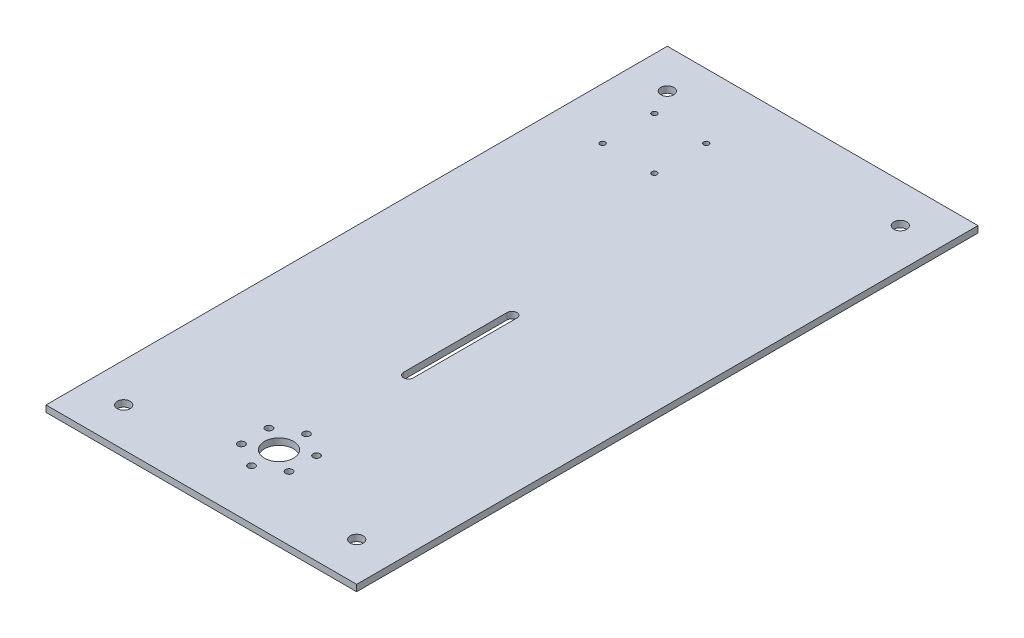
ISO-10303-21;
HEADER;
FILE_DESCRIPTION(('STEP AP214'),'2;1');
FILE_NAME('part.step','',(''),(''),'','','');
FILE_SCHEMA(('AUTOMOTIVE_DESIGN { 1 0 10303 214 1 1 1 1 }'));
ENDSEC;
DATA;
#1=APPLICATION_CONTEXT('core data for automotive mechanical design processes');
#2=APPLICATION_PROTOCOL_DEFINITION('international standard','automotive_design',2000,#1);
#3=PRODUCT_CONTEXT('',#1,'mechanical');
#4=PRODUCT('Part','Part','',(#3));
#5=PRODUCT_RELATED_PRODUCT_CATEGORY('part','',(#4));
#6=PRODUCT_DEFINITION_FORMATION('','',#4);
#7=PRODUCT_DEFINITION_CONTEXT('part definition',#1,'design');
#8=PRODUCT_DEFINITION('design','',#6,#7);
#9=PRODUCT_DEFINITION_SHAPE('','',#8);
#10=(LENGTH_UNIT() NAMED_UNIT(*) SI_UNIT(.MILLI.,.METRE.));
#11=(NAMED_UNIT(*) PLANE_ANGLE_UNIT() SI_UNIT($,.RADIAN.));
#12=(NAMED_UNIT(*) SI_UNIT($,.STERADIAN.) SOLID_ANGLE_UNIT());
#13=UNCERTAINTY_MEASURE_WITH_UNIT(LENGTH_MEASURE(1.E-05),#10,'distance_accuracy_value','');
#14=(GEOMETRIC_REPRESENTATION_CONTEXT(3) GLOBAL_UNCERTAINTY_ASSIGNED_CONTEXT((#13)) GLOBAL_UNIT_ASSIGNED_CONTEXT((#10,
#11,#12)) REPRESENTATION_CONTEXT('',''));
#15=CARTESIAN_POINT('',(0.,0.,0.));
#16=DIRECTION('',(0.,0.,1.));
#17=DIRECTION('',(1.,0.,0.));
#18=AXIS2_PLACEMENT_3D('',#15,#16,#17);
#19=CARTESIAN_POINT('',(0.,0.,0.));
#20=DIRECTION('',(0.,-1.,0.));
#21=DIRECTION('',(0.,0.,-1.));
#22=AXIS2_PLACEMENT_3D('',#19,#20,#21);
#23=PLANE('',#22);
#24=CARTESIAN_POINT('',(101.6,0.,-495.3));
#25=DIRECTION('',(0.,-1.,0.));
#26=DIRECTION('',(0.,0.,-1.));
#27=AXIS2_PLACEMENT_3D('',#24,#25,#26);
#28=CIRCLE('',#27,2.5654);
#29=CARTESIAN_POINT('',(101.6,0.,-497.8654));
#30=VERTEX_POINT('',#29);
#31=EDGE_CURVE('E158',#30,#30,#28,.F.);
#32=ORIENTED_EDGE('',*,*,#31,.T.);
#33=EDGE_LOOP('',(#32));
#34=FACE_BOUND('',#33,.T.);
#35=CARTESIAN_POINT('',(50.8,0.,-495.3));
#36=DIRECTION('',(0.,-1.,0.));
#37=DIRECTION('',(0.,0.,-1.));
#38=AXIS2_PLACEMENT_3D('',#35,#36,#37);
#39=CIRCLE('',#38,2.5654);
#40=CARTESIAN_POINT('',(50.8,0.,-497.8654));
#41=VERTEX_POINT('',#40);
#42=EDGE_CURVE('E161',#41,#41,#39,.F.);
#43=ORIENTED_EDGE('',*,*,#42,.T.);
#44=EDGE_LOOP('',(#43));
#45=FACE_BOUND('',#44,.T.);
#46=CARTESIAN_POINT('',(101.6,0.,-546.1));
#47=DIRECTION('',(0.,-1.,0.));
#48=DIRECTION('',(0.,0.,-1.));
#49=AXIS2_PLACEMENT_3D('',#46,#47,#48);
#50=CIRCLE('',#49,2.5654);
#51=CARTESIAN_POINT('',(101.6,0.,-548.6654));
#52=VERTEX_POINT('',#51);
#53=EDGE_CURVE('E164',#52,#52,#50,.F.);
#54=ORIENTED_EDGE('',*,*,#53,.T.);
#55=EDGE_LOOP('',(#54));
#56=FACE_BOUND('',#55,.T.);
#57=CARTESIAN_POINT('',(50.8,0.,-546.1));
#58=DIRECTION('',(0.,-1.,0.));
#59=DIRECTION('',(0.,0.,-1.));
#60=AXIS2_PLACEMENT_3D('',#57,#58,#59);
#61=CIRCLE('',#60,2.5654);
#62=CARTESIAN_POINT('',(50.8,0.,-548.6654));
#63=VERTEX_POINT('',#62);
#64=EDGE_CURVE('E167',#63,#63,#61,.F.);
#65=ORIENTED_EDGE('',*,*,#64,.T.);
#66=EDGE_LOOP('',(#65));
#67=FACE_BOUND('',#66,.T.);
#68=CARTESIAN_POINT('',(266.7,0.,-38.1));
#69=DIRECTION('',(0.,1.,0.));
#70=DIRECTION('',(0.,0.,1.));
#71=AXIS2_PLACEMENT_3D('',#68,#69,#70);
#72=CIRCLE('',#71,6.35);
#73=CARTESIAN_POINT('',(266.7,0.,-31.75));
#74=VERTEX_POINT('',#73);
#75=EDGE_CURVE('E170',#74,#74,#72,.T.);
#76=ORIENTED_EDGE('',*,*,#75,.T.);
#77=EDGE_LOOP('',(#76));
#78=FACE_BOUND('',#77,.T.);
#79=CARTESIAN_POINT('',(38.1,0.,-38.1));
#80=DIRECTION('',(0.,1.,0.));
#81=DIRECTION('',(0.,0.,1.));
#82=AXIS2_PLACEMENT_3D('',#79,#80,#81);
#83=CIRCLE('',#82,6.35);
#84=CARTESIAN_POINT('',(38.1,0.,-31.75));
#85=VERTEX_POINT('',#84);
#86=EDGE_CURVE('E173',#85,#85,#83,.T.);
#87=ORIENTED_EDGE('',*,*,#86,.T.);
#88=EDGE_LOOP('',(#87));
#89=FACE_BOUND('',#88,.T.);
#90=CARTESIAN_POINT('',(38.1,0.,-571.5));
#91=DIRECTION('',(0.,1.,0.));
#92=DIRECTION('',(0.,0.,1.));
#93=AXIS2_PLACEMENT_3D('',#90,#91,#92);
#94=CIRCLE('',#93,6.35);
#95=CARTESIAN_POINT('',(38.1,0.,-565.15));
#96=VERTEX_POINT('',#95);
#97=EDGE_CURVE('E176',#96,#96,#94,.T.);
#98=ORIENTED_EDGE('',*,*,#97,.T.);
#99=EDGE_LOOP('',(#98));
#100=FACE_BOUND('',#99,.T.);
#101=CARTESIAN_POINT('',(266.7,0.,-571.5));
#102=DIRECTION('',(0.,1.,0.));
#103=DIRECTION('',(0.,0.,1.));
#104=AXIS2_PLACEMENT_3D('',#101,#102,#103);
#105=CIRCLE('',#104,6.35);
#106=CARTESIAN_POINT('',(266.7,0.,-565.15));
#107=VERTEX_POINT('',#106);
#108=EDGE_CURVE('E179',#107,#107,#105,.T.);
#109=ORIENTED_EDGE('',*,*,#108,.T.);
#110=EDGE_LOOP('',(#109));
#111=FACE_BOUND('',#110,.T.);
#112=CARTESIAN_POINT('',(152.4,0.,-76.2));
#113=DIRECTION('',(0.,1.,0.));
#114=DIRECTION('',(0.,0.,1.));
#115=AXIS2_PLACEMENT_3D('',#112,#113,#114);
#116=CIRCLE('',#115,14.2875);
#117=CARTESIAN_POINT('',(152.4,0.,-61.9125));
#118=VERTEX_POINT('',#117);
#119=EDGE_CURVE('E182',#118,#118,#116,.T.);
#120=ORIENTED_EDGE('',*,*,#119,.T.);
#121=EDGE_LOOP('',(#120));
#122=FACE_BOUND('',#121,.T.);
#123=CARTESIAN_POINT('',(175.771860584632,0.,-89.6937499999996));
#124=DIRECTION('',(0.,-1.,0.));
#125=DIRECTION('',(0.,0.,-1.));
#126=AXIS2_PLACEMENT_3D('',#123,#124,#125);
#127=CIRCLE('',#126,3.3782);
#128=CARTESIAN_POINT('',(175.771860584632,0.,-93.0719499999996));
#129=VERTEX_POINT('',#128);
#130=EDGE_CURVE('E185',#129,#129,#127,.F.);
#131=ORIENTED_EDGE('',*,*,#130,.T.);
#132=EDGE_LOOP('',(#131));
#133=FACE_BOUND('',#132,.T.);
#134=CARTESIAN_POINT('',(175.771860584632,0.,-62.7062499999996));
#135=DIRECTION('',(0.,-1.,0.));
#136=DIRECTION('',(0.,0.,-1.));
#137=AXIS2_PLACEMENT_3D('',#134,#135,#136);
#138=CIRCLE('',#137,3.3782);
#139=CARTESIAN_POINT('',(175.771860584632,0.,-66.0844499999996));
#140=VERTEX_POINT('',#139);
#141=EDGE_CURVE('E188',#140,#140,#138,.F.);
#142=ORIENTED_EDGE('',*,*,#141,.T.);
#143=EDGE_LOOP('',(#142));
#144=FACE_BOUND('',#143,.T.);
#145=CARTESIAN_POINT('',(152.399999999999,0.,-49.2125));
#146=DIRECTION('',(0.,-1.,0.));
#147=DIRECTION('',(0.,0.,-1.));
#148=AXIS2_PLACEMENT_3D('',#145,#146,#147);
#149=CIRCLE('',#148,3.3782);
#150=CARTESIAN_POINT('',(152.399999999999,0.,-52.5907));
#151=VERTEX_POINT('',#150);
#152=EDGE_CURVE('E191',#151,#151,#149,.F.);
#153=ORIENTED_EDGE('',*,*,#152,.T.);
#154=EDGE_LOOP('',(#153));
#155=FACE_BOUND('',#154,.T.);
#156=CARTESIAN_POINT('',(129.028139415366,0.,-62.7062500000005));
#157=DIRECTION('',(0.,-1.,0.));
#158=DIRECTION('',(0.,0.,-1.));
#159=AXIS2_PLACEMENT_3D('',#156,#157,#158);
#160=CIRCLE('',#159,3.3782);
#161=CARTESIAN_POINT('',(129.028139415366,0.,-66.0844500000005));
#162=VERTEX_POINT('',#161);
#163=EDGE_CURVE('E194',#162,#162,#160,.F.);
#164=ORIENTED_EDGE('',*,*,#163,.T.);
#165=EDGE_LOOP('',(#164));
#166=FACE_BOUND('',#165,.T.);
#167=CARTESIAN_POINT('',(129.028139415367,0.,-89.6937500000006));
#168=DIRECTION('',(0.,-1.,0.));
#169=DIRECTION('',(0.,0.,-1.));
#170=AXIS2_PLACEMENT_3D('',#167,#168,#169);
#171=CIRCLE('',#170,3.3782);
#172=CARTESIAN_POINT('',(129.028139415367,0.,-93.0719500000006));
#173=VERTEX_POINT('',#172);
#174=EDGE_CURVE('E197',#173,#173,#171,.F.);
#175=ORIENTED_EDGE('',*,*,#174,.T.);
#176=EDGE_LOOP('',(#175));
#177=FACE_BOUND('',#176,.T.);
#178=CARTESIAN_POINT('',(152.4,0.,-103.1875));
#179=DIRECTION('',(0.,-1.,0.));
#180=DIRECTION('',(0.,0.,-1.));
#181=AXIS2_PLACEMENT_3D('',#178,#179,#180);
#182=CIRCLE('',#181,3.3782);
#183=CARTESIAN_POINT('',(152.4,0.,-106.5657));
#184=VERTEX_POINT('',#183);
#185=EDGE_CURVE('E200',#184,#184,#182,.F.);
#186=ORIENTED_EDGE('',*,*,#185,.T.);
#187=EDGE_LOOP('',(#186));
#188=FACE_BOUND('',#187,.T.);
#189=DIRECTION('',(0.,0.,-1.));
#190=VECTOR('',#189,1.);
#191=CARTESIAN_POINT('',(157.1625,0.,-304.8));
#192=LINE('',#191,#190);
#193=CARTESIAN_POINT('',(157.1625,0.,-203.2));
#194=VERTEX_POINT('',#193);
#195=CARTESIAN_POINT('',(157.1625,0.,-304.8));
#196=VERTEX_POINT('',#195);
#197=EDGE_CURVE('E105',#194,#196,#192,.T.);
#198=ORIENTED_EDGE('',*,*,#197,.T.);
#199=CARTESIAN_POINT('',(152.4,0.,-304.8));
#200=DIRECTION('',(0.,-1.,0.));
#201=DIRECTION('',(0.,0.,-1.));
#202=AXIS2_PLACEMENT_3D('',#199,#200,#201);
#203=CIRCLE('',#202,4.76250000000006);
#204=CARTESIAN_POINT('',(147.6375,0.,-304.8));
#205=VERTEX_POINT('',#204);
#206=EDGE_CURVE('E203',#196,#205,#203,.F.);
#207=ORIENTED_EDGE('',*,*,#206,.T.);
#208=DIRECTION('',(0.,0.,1.));
#209=VECTOR('',#208,1.);
#210=CARTESIAN_POINT('',(147.6375,0.,-304.8));
#211=LINE('',#210,#209);
#212=CARTESIAN_POINT('',(147.6375,0.,-203.2));
#213=VERTEX_POINT('',#212);
#214=EDGE_CURVE('E102',#205,#213,#211,.T.);
#215=ORIENTED_EDGE('',*,*,#214,.T.);
#216=CARTESIAN_POINT('',(152.4,0.,-203.2));
#217=DIRECTION('',(0.,-1.,0.));
#218=DIRECTION('',(0.,0.,-1.));
#219=AXIS2_PLACEMENT_3D('',#216,#217,#218);
#220=CIRCLE('',#219,4.76250000000006);
#221=EDGE_CURVE('E19',#213,#194,#220,.F.);
#222=ORIENTED_EDGE('',*,*,#221,.T.);
#223=EDGE_LOOP('',(#198,#207,#215,#222));
#224=FACE_BOUND('',#223,.T.);
#225=DIRECTION('',(-1.,0.,0.));
#226=VECTOR('',#225,1.);
#227=CARTESIAN_POINT('',(0.,0.,0.));
#228=LINE('',#227,#226);
#229=CARTESIAN_POINT('',(304.8,0.,0.));
#230=VERTEX_POINT('',#229);
#231=CARTESIAN_POINT('',(0.,0.,0.));
#232=VERTEX_POINT('',#231);
#233=EDGE_CURVE('E91',#230,#232,#228,.T.);
#234=ORIENTED_EDGE('',*,*,#233,.T.);
#235=DIRECTION('',(0.,0.,-1.));
#236=VECTOR('',#235,1.);
#237=CARTESIAN_POINT('',(0.,0.,0.));
#238=LINE('',#237,#236);
#239=CARTESIAN_POINT('',(0.,0.,-609.6));
#240=VERTEX_POINT('',#239);
#241=EDGE_CURVE('E65',#232,#240,#238,.T.);
#242=ORIENTED_EDGE('',*,*,#241,.T.);
#243=DIRECTION('',(1.,0.,0.));
#244=VECTOR('',#243,1.);
#245=CARTESIAN_POINT('',(0.,0.,-609.6));
#246=LINE('',#245,#244);
#247=CARTESIAN_POINT('',(304.8,0.,-609.6));
#248=VERTEX_POINT('',#247);
#249=EDGE_CURVE('E79',#240,#248,#246,.T.);
#250=ORIENTED_EDGE('',*,*,#249,.T.);
#251=DIRECTION('',(0.,0.,1.));
#252=VECTOR('',#251,1.);
#253=CARTESIAN_POINT('',(304.8,0.,0.));
#254=LINE('',#253,#252);
#255=EDGE_CURVE('E97',#248,#230,#254,.T.);
#256=ORIENTED_EDGE('',*,*,#255,.T.);
#257=EDGE_LOOP('',(#234,#242,#250,#256));
#258=FACE_BOUND('',#257,.T.);
#259=ADVANCED_FACE('F16',(#34,#45,#56,#67,#78,#89,#100,#111,#122,#133,#144,#155,#166,#177,#188,
#224,#258),#23,.T.);
#260=CARTESIAN_POINT('',(0.,6.35,0.));
#261=DIRECTION('',(1.,0.,0.));
#262=DIRECTION('',(0.,0.,-1.));
#263=AXIS2_PLACEMENT_3D('',#260,#261,#262);
#264=PLANE('',#263);
#265=DIRECTION('',(0.,0.,-1.));
#266=VECTOR('',#265,1.);
#267=CARTESIAN_POINT('',(0.,6.35,0.));
#268=LINE('',#267,#266);
#269=CARTESIAN_POINT('',(0.,6.35,0.));
#270=VERTEX_POINT('',#269);
#271=CARTESIAN_POINT('',(0.,6.35,-609.6));
#272=VERTEX_POINT('',#271);
#273=EDGE_CURVE('E96',#270,#272,#268,.T.);
#274=ORIENTED_EDGE('',*,*,#273,.T.);
#275=DIRECTION('',(0.,1.,0.));
#276=VECTOR('',#275,1.);
#277=CARTESIAN_POINT('',(0.,6.35,-609.6));
#278=LINE('',#277,#276);
#279=EDGE_CURVE('E83',#272,#240,#278,.F.);
#280=ORIENTED_EDGE('',*,*,#279,.T.);
#281=ORIENTED_EDGE('',*,*,#241,.F.);
#282=DIRECTION('',(0.,1.,0.));
#283=VECTOR('',#282,1.);
#284=CARTESIAN_POINT('',(0.,6.35,0.));
#285=LINE('',#284,#283);
#286=EDGE_CURVE('E218',#232,#270,#285,.T.);
#287=ORIENTED_EDGE('',*,*,#286,.T.);
#288=EDGE_LOOP('',(#274,#280,#281,#287));
#289=FACE_BOUND('',#288,.T.);
#290=ADVANCED_FACE('F94',(#289),#264,.F.);
#291=CARTESIAN_POINT('',(0.,6.35,-609.6));
#292=DIRECTION('',(0.,0.,1.));
#293=DIRECTION('',(1.,0.,0.));
#294=AXIS2_PLACEMENT_3D('',#291,#292,#293);
#295=PLANE('',#294);
#296=DIRECTION('',(1.,0.,0.));
#297=VECTOR('',#296,1.);
#298=CARTESIAN_POINT('',(0.,6.35,-609.6));
#299=LINE('',#298,#297);
#300=CARTESIAN_POINT('',(304.8,6.35,-609.6));
#301=VERTEX_POINT('',#300);
#302=EDGE_CURVE('E235',#272,#301,#299,.T.);
#303=ORIENTED_EDGE('',*,*,#302,.T.);
#304=DIRECTION('',(0.,1.,0.));
#305=VECTOR('',#304,1.);
#306=CARTESIAN_POINT('',(304.8,6.35,-609.6));
#307=LINE('',#306,#305);
#308=EDGE_CURVE('E86',#301,#248,#307,.F.);
#309=ORIENTED_EDGE('',*,*,#308,.T.);
#310=ORIENTED_EDGE('',*,*,#249,.F.);
#311=ORIENTED_EDGE('',*,*,#279,.F.);
#312=EDGE_LOOP('',(#303,#309,#310,#311));
#313=FACE_BOUND('',#312,.T.);
#314=ADVANCED_FACE('F81',(#313),#295,.F.);
#315=CARTESIAN_POINT('',(304.8,6.35,0.));
#316=DIRECTION('',(-1.,0.,0.));
#317=DIRECTION('',(0.,0.,1.));
#318=AXIS2_PLACEMENT_3D('',#315,#316,#317);
#319=PLANE('',#318);
#320=DIRECTION('',(0.,0.,-1.));
#321=VECTOR('',#320,1.);
#322=CARTESIAN_POINT('',(304.8,6.35,0.));
#323=LINE('',#322,#321);
#324=CARTESIAN_POINT('',(304.8,6.35,0.));
#325=VERTEX_POINT('',#324);
#326=EDGE_CURVE('E231',#301,#325,#323,.F.);
#327=ORIENTED_EDGE('',*,*,#326,.T.);
#328=DIRECTION('',(0.,1.,0.));
#329=VECTOR('',#328,1.);
#330=CARTESIAN_POINT('',(304.8,6.35,0.));
#331=LINE('',#330,#329);
#332=EDGE_CURVE('E104',#325,#230,#331,.F.);
#333=ORIENTED_EDGE('',*,*,#332,.T.);
#334=ORIENTED_EDGE('',*,*,#255,.F.);
#335=ORIENTED_EDGE('',*,*,#308,.F.);
#336=EDGE_LOOP('',(#327,#333,#334,#335));
#337=FACE_BOUND('',#336,.T.);
#338=ADVANCED_FACE('F410',(#337),#319,.F.);
#339=CARTESIAN_POINT('',(0.,6.35,0.));
#340=DIRECTION('',(0.,0.,-1.));
#341=DIRECTION('',(-1.,0.,0.));
#342=AXIS2_PLACEMENT_3D('',#339,#340,#341);
#343=PLANE('',#342);
#344=DIRECTION('',(1.,0.,0.));
#345=VECTOR('',#344,1.);
#346=CARTESIAN_POINT('',(0.,6.35,0.));
#347=LINE('',#346,#345);
#348=EDGE_CURVE('E225',#325,#270,#347,.F.);
#349=ORIENTED_EDGE('',*,*,#348,.T.);
#350=ORIENTED_EDGE('',*,*,#286,.F.);
#351=ORIENTED_EDGE('',*,*,#233,.F.);
#352=ORIENTED_EDGE('',*,*,#332,.F.);
#353=EDGE_LOOP('',(#349,#350,#351,#352));
#354=FACE_BOUND('',#353,.T.);
#355=ADVANCED_FACE('F226',(#354),#343,.F.);
#356=CARTESIAN_POINT('',(147.6375,6.35,-304.8));
#357=DIRECTION('',(-1.,0.,0.));
#358=DIRECTION('',(0.,0.,1.));
#359=AXIS2_PLACEMENT_3D('',#356,#357,#358);
#360=PLANE('',#359);
#361=DIRECTION('',(0.,0.,-1.));
#362=VECTOR('',#361,1.);
#363=CARTESIAN_POINT('',(147.6375,6.35,0.));
#364=LINE('',#363,#362);
#365=CARTESIAN_POINT('',(147.6375,6.35,-304.8));
#366=VERTEX_POINT('',#365);
#367=CARTESIAN_POINT('',(147.6375,6.35,-203.2));
#368=VERTEX_POINT('',#367);
#369=EDGE_CURVE('E157',#366,#368,#364,.F.);
#370=ORIENTED_EDGE('',*,*,#369,.T.);
#371=DIRECTION('',(0.,-1.,0.));
#372=VECTOR('',#371,1.);
#373=CARTESIAN_POINT('',(147.6375,6.35,-203.2));
#374=LINE('',#373,#372);
#375=EDGE_CURVE('E108',#368,#213,#374,.T.);
#376=ORIENTED_EDGE('',*,*,#375,.T.);
#377=ORIENTED_EDGE('',*,*,#214,.F.);
#378=DIRECTION('',(0.,-1.,0.));
#379=VECTOR('',#378,1.);
#380=CARTESIAN_POINT('',(147.6375,6.35,-304.8));
#381=LINE('',#380,#379);
#382=EDGE_CURVE('E202',#205,#366,#381,.F.);
#383=ORIENTED_EDGE('',*,*,#382,.T.);
#384=EDGE_LOOP('',(#370,#376,#377,#383));
#385=FACE_BOUND('',#384,.T.);
#386=ADVANCED_FACE('F250',(#385),#360,.F.);
#387=CARTESIAN_POINT('',(152.4,6.35,-203.2));
#388=DIRECTION('',(0.,-1.,0.));
#389=DIRECTION('',(0.,0.,-1.));
#390=AXIS2_PLACEMENT_3D('',#387,#388,#389);
#391=CYLINDRICAL_SURFACE('',#390,4.76250000000006);
#392=CARTESIAN_POINT('',(152.4,6.35,-203.2));
#393=DIRECTION('',(0.,-1.,0.));
#394=DIRECTION('',(0.,0.,-1.));
#395=AXIS2_PLACEMENT_3D('',#392,#393,#394);
#396=CIRCLE('',#395,4.76250000000006);
#397=CARTESIAN_POINT('',(157.1625,6.35,-203.2));
#398=VERTEX_POINT('',#397);
#399=EDGE_CURVE('E154',#368,#398,#396,.F.);
#400=ORIENTED_EDGE('',*,*,#399,.T.);
#401=DIRECTION('',(0.,1.,0.));
#402=VECTOR('',#401,1.);
#403=CARTESIAN_POINT('',(157.1625,6.35,-203.2));
#404=LINE('',#403,#402);
#405=EDGE_CURVE('E107',#398,#194,#404,.F.);
#406=ORIENTED_EDGE('',*,*,#405,.T.);
#407=ORIENTED_EDGE('',*,*,#221,.F.);
#408=ORIENTED_EDGE('',*,*,#375,.F.);
#409=EDGE_LOOP('',(#400,#406,#407,#408));
#410=FACE_BOUND('',#409,.T.);
#411=ADVANCED_FACE('F251',(#410),#391,.F.);
#412=CARTESIAN_POINT('',(157.1625,6.35,-304.8));
#413=DIRECTION('',(1.,0.,0.));
#414=DIRECTION('',(0.,0.,-1.));
#415=AXIS2_PLACEMENT_3D('',#412,#413,#414);
#416=PLANE('',#415);
#417=DIRECTION('',(0.,0.,-1.));
#418=VECTOR('',#417,1.);
#419=CARTESIAN_POINT('',(157.1625,6.35,0.));
#420=LINE('',#419,#418);
#421=CARTESIAN_POINT('',(157.1625,6.35,-304.8));
#422=VERTEX_POINT('',#421);
#423=EDGE_CURVE('E153',#398,#422,#420,.T.);
#424=ORIENTED_EDGE('',*,*,#423,.T.);
#425=DIRECTION('',(0.,-1.,0.));
#426=VECTOR('',#425,1.);
#427=CARTESIAN_POINT('',(157.1625,6.35,-304.8));
#428=LINE('',#427,#426);
#429=EDGE_CURVE('E34',#422,#196,#428,.T.);
#430=ORIENTED_EDGE('',*,*,#429,.T.);
#431=ORIENTED_EDGE('',*,*,#197,.F.);
#432=ORIENTED_EDGE('',*,*,#405,.F.);
#433=EDGE_LOOP('',(#424,#430,#431,#432));
#434=FACE_BOUND('',#433,.T.);
#435=ADVANCED_FACE('F252',(#434),#416,.F.);
#436=CARTESIAN_POINT('',(152.4,6.35,-304.8));
#437=DIRECTION('',(0.,-1.,0.));
#438=DIRECTION('',(0.,0.,-1.));
#439=AXIS2_PLACEMENT_3D('',#436,#437,#438);
#440=CYLINDRICAL_SURFACE('',#439,4.76250000000006);
#441=ORIENTED_EDGE('',*,*,#382,.F.);
#442=ORIENTED_EDGE('',*,*,#206,.F.);
#443=ORIENTED_EDGE('',*,*,#429,.F.);
#444=CARTESIAN_POINT('',(152.4,6.35,-304.8));
#445=DIRECTION('',(0.,-1.,0.));
#446=DIRECTION('',(0.,0.,-1.));
#447=AXIS2_PLACEMENT_3D('',#444,#445,#446);
#448=CIRCLE('',#447,4.76250000000006);
#449=EDGE_CURVE('E151',#422,#366,#448,.F.);
#450=ORIENTED_EDGE('',*,*,#449,.T.);
#451=EDGE_LOOP('',(#441,#442,#443,#450));
#452=FACE_BOUND('',#451,.T.);
#453=ADVANCED_FACE('F245',(#452),#440,.F.);
#454=CARTESIAN_POINT('',(152.4,0.,-103.1875));
#455=DIRECTION('',(0.,-1.,0.));
#456=DIRECTION('',(0.,0.,-1.));
#457=AXIS2_PLACEMENT_3D('',#454,#455,#456);
#458=CYLINDRICAL_SURFACE('',#457,3.3782);
#459=ORIENTED_EDGE('',*,*,#185,.F.);
#460=EDGE_LOOP('',(#459));
#461=FACE_BOUND('',#460,.T.);
#462=CARTESIAN_POINT('',(152.4,6.35,-103.1875));
#463=DIRECTION('',(0.,-1.,0.));
#464=DIRECTION('',(0.,0.,-1.));
#465=AXIS2_PLACEMENT_3D('',#462,#463,#464);
#466=CIRCLE('',#465,3.3782);
#467=CARTESIAN_POINT('',(152.4,6.35,-106.5657));
#468=VERTEX_POINT('',#467);
#469=EDGE_CURVE('E148',#468,#468,#466,.F.);
#470=ORIENTED_EDGE('',*,*,#469,.T.);
#471=EDGE_LOOP('',(#470));
#472=FACE_BOUND('',#471,.T.);
#473=ADVANCED_FACE('F260',(#461,#472),#458,.F.);
#474=CARTESIAN_POINT('',(129.028139415367,0.,-89.6937500000006));
#475=DIRECTION('',(0.,-1.,0.));
#476=DIRECTION('',(0.,0.,-1.));
#477=AXIS2_PLACEMENT_3D('',#474,#475,#476);
#478=CYLINDRICAL_SURFACE('',#477,3.3782);
#479=ORIENTED_EDGE('',*,*,#174,.F.);
#480=EDGE_LOOP('',(#479));
#481=FACE_BOUND('',#480,.T.);
#482=CARTESIAN_POINT('',(129.028139415367,6.35,-89.6937500000006));
#483=DIRECTION('',(0.,-1.,0.));
#484=DIRECTION('',(0.,0.,-1.));
#485=AXIS2_PLACEMENT_3D('',#482,#483,#484);
#486=CIRCLE('',#485,3.3782);
#487=CARTESIAN_POINT('',(129.028139415367,6.35,-93.0719500000006));
#488=VERTEX_POINT('',#487);
#489=EDGE_CURVE('E145',#488,#488,#486,.F.);
#490=ORIENTED_EDGE('',*,*,#489,.T.);
#491=EDGE_LOOP('',(#490));
#492=FACE_BOUND('',#491,.T.);
#493=ADVANCED_FACE('F322',(#481,#492),#478,.F.);
#494=CARTESIAN_POINT('',(129.028139415366,0.,-62.7062500000005));
#495=DIRECTION('',(0.,-1.,0.));
#496=DIRECTION('',(0.,0.,-1.));
#497=AXIS2_PLACEMENT_3D('',#494,#495,#496);
#498=CYLINDRICAL_SURFACE('',#497,3.3782);
#499=ORIENTED_EDGE('',*,*,#163,.F.);
#500=EDGE_LOOP('',(#499));
#501=FACE_BOUND('',#500,.T.);
#502=CARTESIAN_POINT('',(129.028139415366,6.35,-62.7062500000005));
#503=DIRECTION('',(0.,-1.,0.));
#504=DIRECTION('',(0.,0.,-1.));
#505=AXIS2_PLACEMENT_3D('',#502,#503,#504);
#506=CIRCLE('',#505,3.3782);
#507=CARTESIAN_POINT('',(129.028139415366,6.35,-66.0844500000005));
#508=VERTEX_POINT('',#507);
#509=EDGE_CURVE('E142',#508,#508,#506,.F.);
#510=ORIENTED_EDGE('',*,*,#509,.T.);
#511=EDGE_LOOP('',(#510));
#512=FACE_BOUND('',#511,.T.);
#513=ADVANCED_FACE('F318',(#501,#512),#498,.F.);
#514=CARTESIAN_POINT('',(152.399999999999,0.,-49.2125));
#515=DIRECTION('',(0.,-1.,0.));
#516=DIRECTION('',(0.,0.,-1.));
#517=AXIS2_PLACEMENT_3D('',#514,#515,#516);
#518=CYLINDRICAL_SURFACE('',#517,3.3782);
#519=ORIENTED_EDGE('',*,*,#152,.F.);
#520=EDGE_LOOP('',(#519));
#521=FACE_BOUND('',#520,.T.);
#522=CARTESIAN_POINT('',(152.399999999999,6.35,-49.2125));
#523=DIRECTION('',(0.,-1.,0.));
#524=DIRECTION('',(0.,0.,-1.));
#525=AXIS2_PLACEMENT_3D('',#522,#523,#524);
#526=CIRCLE('',#525,3.3782);
#527=CARTESIAN_POINT('',(152.399999999999,6.35,-52.5907));
#528=VERTEX_POINT('',#527);
#529=EDGE_CURVE('E139',#528,#528,#526,.F.);
#530=ORIENTED_EDGE('',*,*,#529,.T.);
#531=EDGE_LOOP('',(#530));
#532=FACE_BOUND('',#531,.T.);
#533=ADVANCED_FACE('F314',(#521,#532),#518,.F.);
#534=CARTESIAN_POINT('',(175.771860584632,0.,-62.7062499999996));
#535=DIRECTION('',(0.,-1.,0.));
#536=DIRECTION('',(0.,0.,-1.));
#537=AXIS2_PLACEMENT_3D('',#534,#535,#536);
#538=CYLINDRICAL_SURFACE('',#537,3.3782);
#539=ORIENTED_EDGE('',*,*,#141,.F.);
#540=EDGE_LOOP('',(#539));
#541=FACE_BOUND('',#540,.T.);
#542=CARTESIAN_POINT('',(175.771860584632,6.35,-62.7062499999996));
#543=DIRECTION('',(0.,-1.,0.));
#544=DIRECTION('',(0.,0.,-1.));
#545=AXIS2_PLACEMENT_3D('',#542,#543,#544);
#546=CIRCLE('',#545,3.3782);
#547=CARTESIAN_POINT('',(175.771860584632,6.35,-66.0844499999996));
#548=VERTEX_POINT('',#547);
#549=EDGE_CURVE('E136',#548,#548,#546,.F.);
#550=ORIENTED_EDGE('',*,*,#549,.T.);
#551=EDGE_LOOP('',(#550));
#552=FACE_BOUND('',#551,.T.);
#553=ADVANCED_FACE('F310',(#541,#552),#538,.F.);
#554=CARTESIAN_POINT('',(175.771860584632,0.,-89.6937499999996));
#555=DIRECTION('',(0.,-1.,0.));
#556=DIRECTION('',(0.,0.,-1.));
#557=AXIS2_PLACEMENT_3D('',#554,#555,#556);
#558=CYLINDRICAL_SURFACE('',#557,3.3782);
#559=ORIENTED_EDGE('',*,*,#130,.F.);
#560=EDGE_LOOP('',(#559));
#561=FACE_BOUND('',#560,.T.);
#562=CARTESIAN_POINT('',(175.771860584632,6.35,-89.6937499999996));
#563=DIRECTION('',(0.,-1.,0.));
#564=DIRECTION('',(0.,0.,-1.));
#565=AXIS2_PLACEMENT_3D('',#562,#563,#564);
#566=CIRCLE('',#565,3.3782);
#567=CARTESIAN_POINT('',(175.771860584632,6.35,-93.0719499999996));
#568=VERTEX_POINT('',#567);
#569=EDGE_CURVE('E133',#568,#568,#566,.F.);
#570=ORIENTED_EDGE('',*,*,#569,.T.);
#571=EDGE_LOOP('',(#570));
#572=FACE_BOUND('',#571,.T.);
#573=ADVANCED_FACE('F306',(#561,#572),#558,.F.);
#574=CARTESIAN_POINT('',(152.4,0.,-76.2));
#575=DIRECTION('',(0.,1.,0.));
#576=DIRECTION('',(0.,0.,1.));
#577=AXIS2_PLACEMENT_3D('',#574,#575,#576);
#578=CYLINDRICAL_SURFACE('',#577,14.2875);
#579=CARTESIAN_POINT('',(152.4,6.35,-76.2));
#580=DIRECTION('',(0.,1.,0.));
#581=DIRECTION('',(0.,0.,1.));
#582=AXIS2_PLACEMENT_3D('',#579,#580,#581);
#583=CIRCLE('',#582,14.2875);
#584=CARTESIAN_POINT('',(152.4,6.35,-61.9125));
#585=VERTEX_POINT('',#584);
#586=EDGE_CURVE('E130',#585,#585,#583,.T.);
#587=ORIENTED_EDGE('',*,*,#586,.T.);
#588=EDGE_LOOP('',(#587));
#589=FACE_BOUND('',#588,.T.);
#590=ORIENTED_EDGE('',*,*,#119,.F.);
#591=EDGE_LOOP('',(#590));
#592=FACE_BOUND('',#591,.T.);
#593=ADVANCED_FACE('F302',(#589,#592),#578,.F.);
#594=CARTESIAN_POINT('',(266.7,6.35,-571.5));
#595=DIRECTION('',(0.,1.,0.));
#596=DIRECTION('',(0.,0.,1.));
#597=AXIS2_PLACEMENT_3D('',#594,#595,#596);
#598=CYLINDRICAL_SURFACE('',#597,6.35);
#599=ORIENTED_EDGE('',*,*,#108,.F.);
#600=EDGE_LOOP('',(#599));
#601=FACE_BOUND('',#600,.T.);
#602=CARTESIAN_POINT('',(266.7,6.35,-571.5));
#603=DIRECTION('',(0.,1.,0.));
#604=DIRECTION('',(0.,0.,1.));
#605=AXIS2_PLACEMENT_3D('',#602,#603,#604);
#606=CIRCLE('',#605,6.35);
#607=CARTESIAN_POINT('',(266.7,6.35,-565.15));
#608=VERTEX_POINT('',#607);
#609=EDGE_CURVE('E127',#608,#608,#606,.T.);
#610=ORIENTED_EDGE('',*,*,#609,.T.);
#611=EDGE_LOOP('',(#610));
#612=FACE_BOUND('',#611,.T.);
#613=ADVANCED_FACE('F298',(#601,#612),#598,.F.);
#614=CARTESIAN_POINT('',(38.1,6.35,-571.5));
#615=DIRECTION('',(0.,1.,0.));
#616=DIRECTION('',(0.,0.,1.));
#617=AXIS2_PLACEMENT_3D('',#614,#615,#616);
#618=CYLINDRICAL_SURFACE('',#617,6.35);
#619=ORIENTED_EDGE('',*,*,#97,.F.);
#620=EDGE_LOOP('',(#619));
#621=FACE_BOUND('',#620,.T.);
#622=CARTESIAN_POINT('',(38.1,6.35,-571.5));
#623=DIRECTION('',(0.,1.,0.));
#624=DIRECTION('',(0.,0.,1.));
#625=AXIS2_PLACEMENT_3D('',#622,#623,#624);
#626=CIRCLE('',#625,6.35);
#627=CARTESIAN_POINT('',(38.1,6.35,-565.15));
#628=VERTEX_POINT('',#627);
#629=EDGE_CURVE('E124',#628,#628,#626,.T.);
#630=ORIENTED_EDGE('',*,*,#629,.T.);
#631=EDGE_LOOP('',(#630));
#632=FACE_BOUND('',#631,.T.);
#633=ADVANCED_FACE('F294',(#621,#632),#618,.F.);
#634=CARTESIAN_POINT('',(38.1,6.35,-38.1));
#635=DIRECTION('',(0.,1.,0.));
#636=DIRECTION('',(0.,0.,1.));
#637=AXIS2_PLACEMENT_3D('',#634,#635,#636);
#638=CYLINDRICAL_SURFACE('',#637,6.35);
#639=ORIENTED_EDGE('',*,*,#86,.F.);
#640=EDGE_LOOP('',(#639));
#641=FACE_BOUND('',#640,.T.);
#642=CARTESIAN_POINT('',(38.1,6.35,-38.1));
#643=DIRECTION('',(0.,1.,0.));
#644=DIRECTION('',(0.,0.,1.));
#645=AXIS2_PLACEMENT_3D('',#642,#643,#644);
#646=CIRCLE('',#645,6.35);
#647=CARTESIAN_POINT('',(38.1,6.35,-31.75));
#648=VERTEX_POINT('',#647);
#649=EDGE_CURVE('E121',#648,#648,#646,.T.);
#650=ORIENTED_EDGE('',*,*,#649,.T.);
#651=EDGE_LOOP('',(#650));
#652=FACE_BOUND('',#651,.T.);
#653=ADVANCED_FACE('F290',(#641,#652),#638,.F.);
#654=CARTESIAN_POINT('',(266.7,6.35,-38.1));
#655=DIRECTION('',(0.,1.,0.));
#656=DIRECTION('',(0.,0.,1.));
#657=AXIS2_PLACEMENT_3D('',#654,#655,#656);
#658=CYLINDRICAL_SURFACE('',#657,6.35);
#659=ORIENTED_EDGE('',*,*,#75,.F.);
#660=EDGE_LOOP('',(#659));
#661=FACE_BOUND('',#660,.T.);
#662=CARTESIAN_POINT('',(266.7,6.35,-38.1));
#663=DIRECTION('',(0.,1.,0.));
#664=DIRECTION('',(0.,0.,1.));
#665=AXIS2_PLACEMENT_3D('',#662,#663,#664);
#666=CIRCLE('',#665,6.35);
#667=CARTESIAN_POINT('',(266.7,6.35,-31.75));
#668=VERTEX_POINT('',#667);
#669=EDGE_CURVE('E118',#668,#668,#666,.T.);
#670=ORIENTED_EDGE('',*,*,#669,.T.);
#671=EDGE_LOOP('',(#670));
#672=FACE_BOUND('',#671,.T.);
#673=ADVANCED_FACE('F286',(#661,#672),#658,.F.);
#674=CARTESIAN_POINT('',(50.8,0.,-546.1));
#675=DIRECTION('',(0.,-1.,0.));
#676=DIRECTION('',(0.,0.,-1.));
#677=AXIS2_PLACEMENT_3D('',#674,#675,#676);
#678=CYLINDRICAL_SURFACE('',#677,2.5654);
#679=ORIENTED_EDGE('',*,*,#64,.F.);
#680=EDGE_LOOP('',(#679));
#681=FACE_BOUND('',#680,.T.);
#682=CARTESIAN_POINT('',(50.8,6.35,-546.1));
#683=DIRECTION('',(0.,-1.,0.));
#684=DIRECTION('',(0.,0.,-1.));
#685=AXIS2_PLACEMENT_3D('',#682,#683,#684);
#686=CIRCLE('',#685,2.5654);
#687=CARTESIAN_POINT('',(50.8,6.35,-548.6654));
#688=VERTEX_POINT('',#687);
#689=EDGE_CURVE('E115',#688,#688,#686,.F.);
#690=ORIENTED_EDGE('',*,*,#689,.T.);
#691=EDGE_LOOP('',(#690));
#692=FACE_BOUND('',#691,.T.);
#693=ADVANCED_FACE('F282',(#681,#692),#678,.F.);
#694=CARTESIAN_POINT('',(101.6,0.,-546.1));
#695=DIRECTION('',(0.,-1.,0.));
#696=DIRECTION('',(0.,0.,-1.));
#697=AXIS2_PLACEMENT_3D('',#694,#695,#696);
#698=CYLINDRICAL_SURFACE('',#697,2.5654);
#699=ORIENTED_EDGE('',*,*,#53,.F.);
#700=EDGE_LOOP('',(#699));
#701=FACE_BOUND('',#700,.T.);
#702=CARTESIAN_POINT('',(101.6,6.35,-546.1));
#703=DIRECTION('',(0.,-1.,0.));
#704=DIRECTION('',(0.,0.,-1.));
#705=AXIS2_PLACEMENT_3D('',#702,#703,#704);
#706=CIRCLE('',#705,2.5654);
#707=CARTESIAN_POINT('',(101.6,6.35,-548.6654));
#708=VERTEX_POINT('',#707);
#709=EDGE_CURVE('E112',#708,#708,#706,.F.);
#710=ORIENTED_EDGE('',*,*,#709,.T.);
#711=EDGE_LOOP('',(#710));
#712=FACE_BOUND('',#711,.T.);
#713=ADVANCED_FACE('F278',(#701,#712),#698,.F.);
#714=CARTESIAN_POINT('',(50.8,0.,-495.3));
#715=DIRECTION('',(0.,-1.,0.));
#716=DIRECTION('',(0.,0.,-1.));
#717=AXIS2_PLACEMENT_3D('',#714,#715,#716);
#718=CYLINDRICAL_SURFACE('',#717,2.5654);
#719=ORIENTED_EDGE('',*,*,#42,.F.);
#720=EDGE_LOOP('',(#719));
#721=FACE_BOUND('',#720,.T.);
#722=CARTESIAN_POINT('',(50.8,6.35,-495.3));
#723=DIRECTION('',(0.,-1.,0.));
#724=DIRECTION('',(0.,0.,-1.));
#725=AXIS2_PLACEMENT_3D('',#722,#723,#724);
#726=CIRCLE('',#725,2.5654);
#727=CARTESIAN_POINT('',(50.8,6.35,-497.8654));
#728=VERTEX_POINT('',#727);
#729=EDGE_CURVE('E25',#728,#728,#726,.F.);
#730=ORIENTED_EDGE('',*,*,#729,.T.);
#731=EDGE_LOOP('',(#730));
#732=FACE_BOUND('',#731,.T.);
#733=ADVANCED_FACE('F270',(#721,#732),#718,.F.);
#734=CARTESIAN_POINT('',(101.6,0.,-495.3));
#735=DIRECTION('',(0.,-1.,0.));
#736=DIRECTION('',(0.,0.,-1.));
#737=AXIS2_PLACEMENT_3D('',#734,#735,#736);
#738=CYLINDRICAL_SURFACE('',#737,2.5654);
#739=ORIENTED_EDGE('',*,*,#31,.F.);
#740=EDGE_LOOP('',(#739));
#741=FACE_BOUND('',#740,.T.);
#742=CARTESIAN_POINT('',(101.6,6.35,-495.3));
#743=DIRECTION('',(0.,-1.,0.));
#744=DIRECTION('',(0.,0.,-1.));
#745=AXIS2_PLACEMENT_3D('',#742,#743,#744);
#746=CIRCLE('',#745,2.5654);
#747=CARTESIAN_POINT('',(101.6,6.35,-497.8654));
#748=VERTEX_POINT('',#747);
#749=EDGE_CURVE('E11',#748,#748,#746,.F.);
#750=ORIENTED_EDGE('',*,*,#749,.T.);
#751=EDGE_LOOP('',(#750));
#752=FACE_BOUND('',#751,.T.);
#753=ADVANCED_FACE('F264',(#741,#752),#738,.F.);
#754=CARTESIAN_POINT('',(0.,6.35,0.));
#755=DIRECTION('',(0.,-1.,0.));
#756=DIRECTION('',(0.,0.,-1.));
#757=AXIS2_PLACEMENT_3D('',#754,#755,#756);
#758=PLANE('',#757);
#759=ORIENTED_EDGE('',*,*,#749,.F.);
#760=EDGE_LOOP('',(#759));
#761=FACE_BOUND('',#760,.T.);
#762=ORIENTED_EDGE('',*,*,#729,.F.);
#763=EDGE_LOOP('',(#762));
#764=FACE_BOUND('',#763,.T.);
#765=ORIENTED_EDGE('',*,*,#709,.F.);
#766=EDGE_LOOP('',(#765));
#767=FACE_BOUND('',#766,.T.);
#768=ORIENTED_EDGE('',*,*,#689,.F.);
#769=EDGE_LOOP('',(#768));
#770=FACE_BOUND('',#769,.T.);
#771=ORIENTED_EDGE('',*,*,#669,.F.);
#772=EDGE_LOOP('',(#771));
#773=FACE_BOUND('',#772,.T.);
#774=ORIENTED_EDGE('',*,*,#649,.F.);
#775=EDGE_LOOP('',(#774));
#776=FACE_BOUND('',#775,.T.);
#777=ORIENTED_EDGE('',*,*,#629,.F.);
#778=EDGE_LOOP('',(#777));
#779=FACE_BOUND('',#778,.T.);
#780=ORIENTED_EDGE('',*,*,#609,.F.);
#781=EDGE_LOOP('',(#780));
#782=FACE_BOUND('',#781,.T.);
#783=ORIENTED_EDGE('',*,*,#586,.F.);
#784=EDGE_LOOP('',(#783));
#785=FACE_BOUND('',#784,.T.);
#786=ORIENTED_EDGE('',*,*,#569,.F.);
#787=EDGE_LOOP('',(#786));
#788=FACE_BOUND('',#787,.T.);
#789=ORIENTED_EDGE('',*,*,#549,.F.);
#790=EDGE_LOOP('',(#789));
#791=FACE_BOUND('',#790,.T.);
#792=ORIENTED_EDGE('',*,*,#529,.F.);
#793=EDGE_LOOP('',(#792));
#794=FACE_BOUND('',#793,.T.);
#795=ORIENTED_EDGE('',*,*,#509,.F.);
#796=EDGE_LOOP('',(#795));
#797=FACE_BOUND('',#796,.T.);
#798=ORIENTED_EDGE('',*,*,#489,.F.);
#799=EDGE_LOOP('',(#798));
#800=FACE_BOUND('',#799,.T.);
#801=ORIENTED_EDGE('',*,*,#469,.F.);
#802=EDGE_LOOP('',(#801));
#803=FACE_BOUND('',#802,.T.);
#804=ORIENTED_EDGE('',*,*,#449,.F.);
#805=ORIENTED_EDGE('',*,*,#423,.F.);
#806=ORIENTED_EDGE('',*,*,#399,.F.);
#807=ORIENTED_EDGE('',*,*,#369,.F.);
#808=EDGE_LOOP('',(#804,#805,#806,#807));
#809=FACE_BOUND('',#808,.T.);
#810=ORIENTED_EDGE('',*,*,#326,.F.);
#811=ORIENTED_EDGE('',*,*,#302,.F.);
#812=ORIENTED_EDGE('',*,*,#273,.F.);
#813=ORIENTED_EDGE('',*,*,#348,.F.);
#814=EDGE_LOOP('',(#810,#811,#812,#813));
#815=FACE_BOUND('',#814,.T.);
#816=ADVANCED_FACE('F241',(#761,#764,#767,#770,#773,#776,#779,#782,#785,#788,#791,#794,#797,
#800,#803,#809,#815),#758,.F.);
#817=CLOSED_SHELL('',(#259,#290,#314,#338,#355,#386,#411,#435,#453,#473,#493,#513,#533,#553,
#573,#593,#613,#633,#653,#673,#693,#713,#733,#753,#816));
#818=MANIFOLD_SOLID_BREP('B1',#817);
#819=ADVANCED_BREP_SHAPE_REPRESENTATION('',(#18,#818),#14);
#820=SHAPE_DEFINITION_REPRESENTATION(#9,#819);
ENDSEC;
END-ISO-10303-21;
